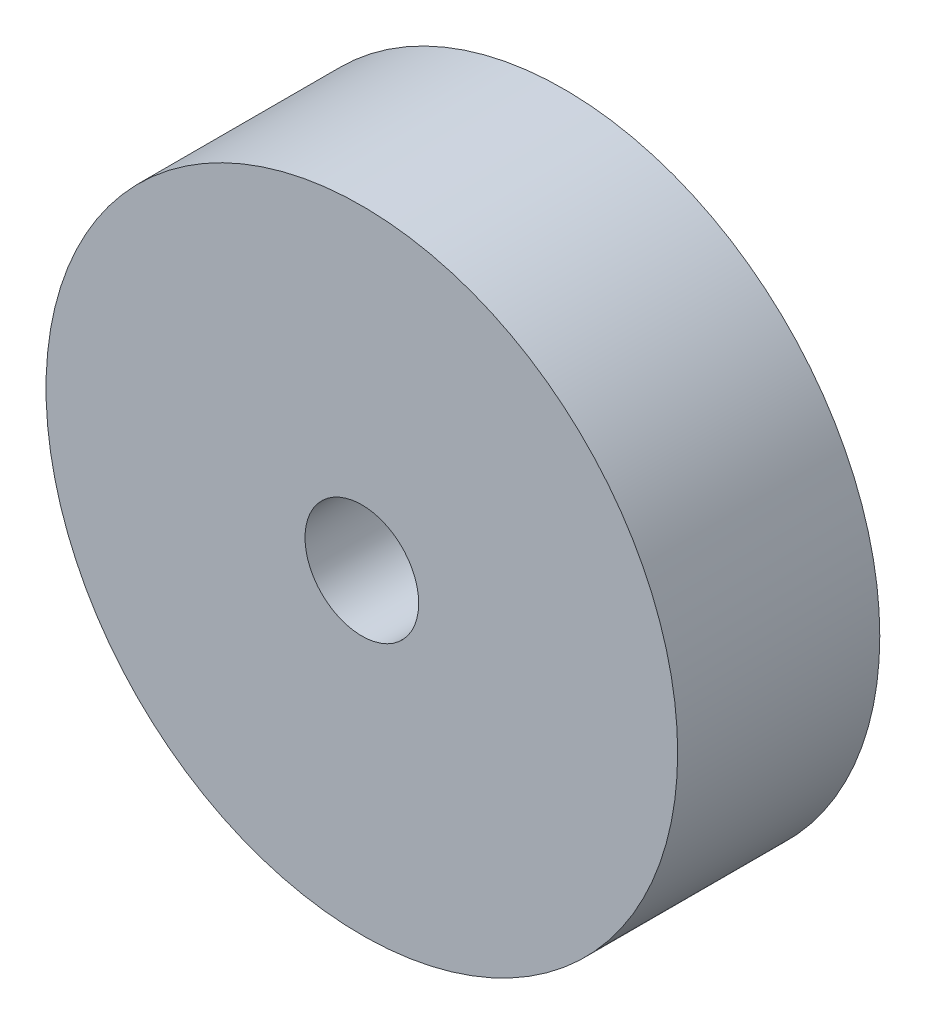
ISO-10303-21;
HEADER;
FILE_DESCRIPTION(('STEP AP214'),'2;1');
FILE_NAME('part.step','',(''),(''),'','','');
FILE_SCHEMA(('AUTOMOTIVE_DESIGN { 1 0 10303 214 1 1 1 1 }'));
ENDSEC;
DATA;
#1=APPLICATION_CONTEXT('core data for automotive mechanical design processes');
#2=APPLICATION_PROTOCOL_DEFINITION('international standard','automotive_design',2000,#1);
#3=PRODUCT_CONTEXT('',#1,'mechanical');
#4=PRODUCT('Part','Part','',(#3));
#5=PRODUCT_RELATED_PRODUCT_CATEGORY('part','',(#4));
#6=PRODUCT_DEFINITION_FORMATION('','',#4);
#7=PRODUCT_DEFINITION_CONTEXT('part definition',#1,'design');
#8=PRODUCT_DEFINITION('design','',#6,#7);
#9=PRODUCT_DEFINITION_SHAPE('','',#8);
#10=(LENGTH_UNIT() NAMED_UNIT(*) SI_UNIT(.MILLI.,.METRE.));
#11=(NAMED_UNIT(*) PLANE_ANGLE_UNIT() SI_UNIT($,.RADIAN.));
#12=(NAMED_UNIT(*) SI_UNIT($,.STERADIAN.) SOLID_ANGLE_UNIT());
#13=UNCERTAINTY_MEASURE_WITH_UNIT(LENGTH_MEASURE(1.E-05),#10,'distance_accuracy_value','');
#14=(GEOMETRIC_REPRESENTATION_CONTEXT(3) GLOBAL_UNCERTAINTY_ASSIGNED_CONTEXT((#13)) GLOBAL_UNIT_ASSIGNED_CONTEXT((#10,
#11,#12)) REPRESENTATION_CONTEXT('',''));
#15=CARTESIAN_POINT('',(0.,0.,0.));
#16=DIRECTION('',(0.,0.,1.));
#17=DIRECTION('',(1.,0.,0.));
#18=AXIS2_PLACEMENT_3D('',#15,#16,#17);
#19=CARTESIAN_POINT('',(0.,0.,8.));
#20=DIRECTION('',(0.,0.,1.));
#21=DIRECTION('',(1.,0.,0.));
#22=AXIS2_PLACEMENT_3D('',#19,#20,#21);
#23=PLANE('',#22);
#24=CARTESIAN_POINT('',(0.,0.,8.));
#25=DIRECTION('',(0.,0.,1.));
#26=DIRECTION('',(1.,0.,0.));
#27=AXIS2_PLACEMENT_3D('',#24,#25,#26);
#28=CIRCLE('',#27,12.5);
#29=CARTESIAN_POINT('',(12.5,0.,8.));
#30=VERTEX_POINT('',#29);
#31=EDGE_CURVE('E10',#30,#30,#28,.T.);
#32=ORIENTED_EDGE('',*,*,#31,.T.);
#33=EDGE_LOOP('',(#32));
#34=FACE_BOUND('',#33,.T.);
#35=CARTESIAN_POINT('',(0.,0.,8.));
#36=DIRECTION('',(0.,0.,1.));
#37=DIRECTION('',(1.,0.,0.));
#38=AXIS2_PLACEMENT_3D('',#35,#36,#37);
#39=CIRCLE('',#38,2.25);
#40=CARTESIAN_POINT('',(2.25,0.,8.));
#41=VERTEX_POINT('',#40);
#42=EDGE_CURVE('E42',#41,#41,#39,.T.);
#43=ORIENTED_EDGE('',*,*,#42,.F.);
#44=EDGE_LOOP('',(#43));
#45=FACE_BOUND('',#44,.T.);
#46=ADVANCED_FACE('F31',(#34,#45),#23,.T.);
#47=CARTESIAN_POINT('',(0.,0.,0.));
#48=DIRECTION('',(0.,0.,1.));
#49=DIRECTION('',(1.,0.,0.));
#50=AXIS2_PLACEMENT_3D('',#47,#48,#49);
#51=PLANE('',#50);
#52=CARTESIAN_POINT('',(0.,0.,0.));
#53=DIRECTION('',(0.,0.,1.));
#54=DIRECTION('',(1.,0.,0.));
#55=AXIS2_PLACEMENT_3D('',#52,#53,#54);
#56=CIRCLE('',#55,12.5);
#57=CARTESIAN_POINT('',(12.5,0.,0.));
#58=VERTEX_POINT('',#57);
#59=EDGE_CURVE('E35',#58,#58,#56,.T.);
#60=ORIENTED_EDGE('',*,*,#59,.F.);
#61=EDGE_LOOP('',(#60));
#62=FACE_BOUND('',#61,.T.);
#63=CARTESIAN_POINT('',(0.,0.,0.));
#64=DIRECTION('',(0.,0.,1.));
#65=DIRECTION('',(1.,0.,0.));
#66=AXIS2_PLACEMENT_3D('',#63,#64,#65);
#67=CIRCLE('',#66,2.25);
#68=CARTESIAN_POINT('',(2.25,0.,0.));
#69=VERTEX_POINT('',#68);
#70=EDGE_CURVE('E44',#69,#69,#67,.T.);
#71=ORIENTED_EDGE('',*,*,#70,.T.);
#72=EDGE_LOOP('',(#71));
#73=FACE_BOUND('',#72,.T.);
#74=ADVANCED_FACE('F54',(#62,#73),#51,.F.);
#75=CARTESIAN_POINT('',(0.,0.,8.));
#76=DIRECTION('',(0.,0.,-1.));
#77=DIRECTION('',(-1.,0.,0.));
#78=AXIS2_PLACEMENT_3D('',#75,#76,#77);
#79=CYLINDRICAL_SURFACE('',#78,12.5);
#80=ORIENTED_EDGE('',*,*,#31,.F.);
#81=EDGE_LOOP('',(#80));
#82=FACE_BOUND('',#81,.T.);
#83=ORIENTED_EDGE('',*,*,#59,.T.);
#84=EDGE_LOOP('',(#83));
#85=FACE_BOUND('',#84,.T.);
#86=ADVANCED_FACE('F33',(#82,#85),#79,.T.);
#87=CARTESIAN_POINT('',(0.,0.,8.));
#88=DIRECTION('',(0.,0.,-1.));
#89=DIRECTION('',(-1.,0.,0.));
#90=AXIS2_PLACEMENT_3D('',#87,#88,#89);
#91=CYLINDRICAL_SURFACE('',#90,2.25);
#92=ORIENTED_EDGE('',*,*,#42,.T.);
#93=EDGE_LOOP('',(#92));
#94=FACE_BOUND('',#93,.T.);
#95=ORIENTED_EDGE('',*,*,#70,.F.);
#96=EDGE_LOOP('',(#95));
#97=FACE_BOUND('',#96,.T.);
#98=ADVANCED_FACE('F50',(#94,#97),#91,.F.);
#99=CLOSED_SHELL('',(#46,#74,#86,#98));
#100=MANIFOLD_SOLID_BREP('B2',#99);
#101=ADVANCED_BREP_SHAPE_REPRESENTATION('',(#18,#100),#14);
#102=SHAPE_DEFINITION_REPRESENTATION(#9,#101);
ENDSEC;
END-ISO-10303-21;
